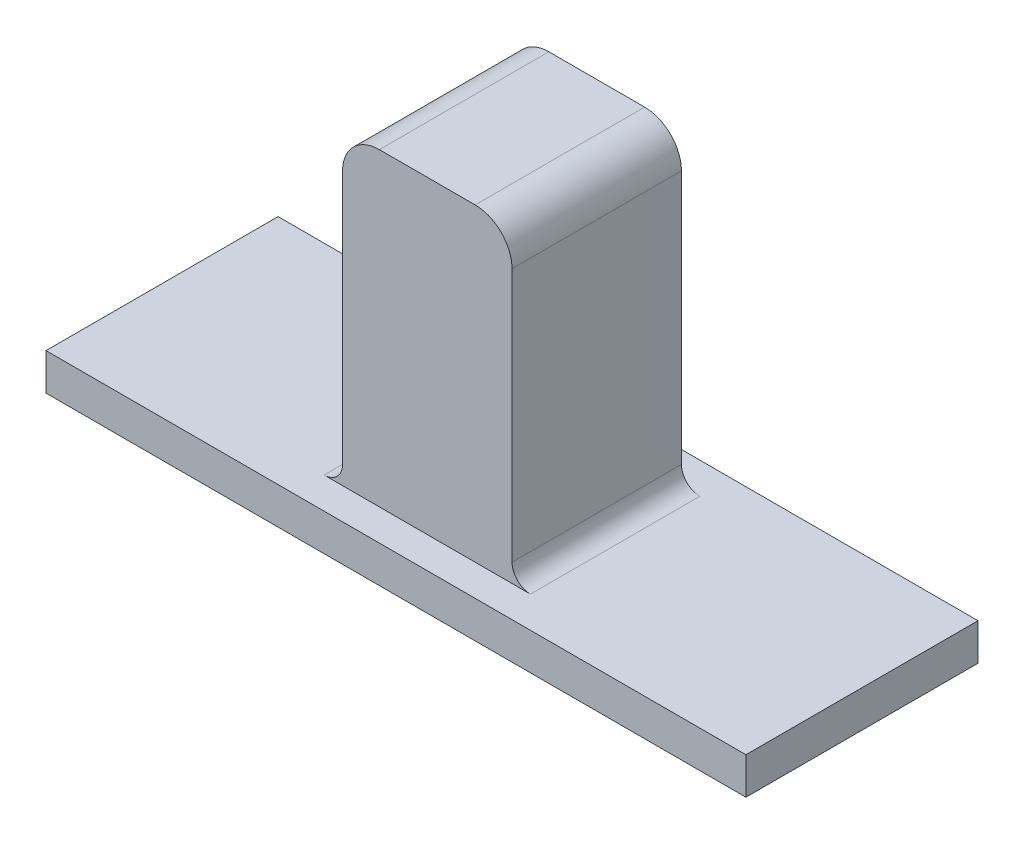
ISO-10303-21;
HEADER;
FILE_DESCRIPTION(('STEP AP214'),'2;1');
FILE_NAME('part.step','',(''),(''),'','','');
FILE_SCHEMA(('AUTOMOTIVE_DESIGN { 1 0 10303 214 1 1 1 1 }'));
ENDSEC;
DATA;
#1=APPLICATION_CONTEXT('core data for automotive mechanical design processes');
#2=APPLICATION_PROTOCOL_DEFINITION('international standard','automotive_design',2000,#1);
#3=PRODUCT_CONTEXT('',#1,'mechanical');
#4=PRODUCT('Part','Part','',(#3));
#5=PRODUCT_RELATED_PRODUCT_CATEGORY('part','',(#4));
#6=PRODUCT_DEFINITION_FORMATION('','',#4);
#7=PRODUCT_DEFINITION_CONTEXT('part definition',#1,'design');
#8=PRODUCT_DEFINITION('design','',#6,#7);
#9=PRODUCT_DEFINITION_SHAPE('','',#8);
#10=(LENGTH_UNIT() NAMED_UNIT(*) SI_UNIT(.MILLI.,.METRE.));
#11=(NAMED_UNIT(*) PLANE_ANGLE_UNIT() SI_UNIT($,.RADIAN.));
#12=(NAMED_UNIT(*) SI_UNIT($,.STERADIAN.) SOLID_ANGLE_UNIT());
#13=UNCERTAINTY_MEASURE_WITH_UNIT(LENGTH_MEASURE(1.E-05),#10,'distance_accuracy_value','');
#14=(GEOMETRIC_REPRESENTATION_CONTEXT(3) GLOBAL_UNCERTAINTY_ASSIGNED_CONTEXT((#13)) GLOBAL_UNIT_ASSIGNED_CONTEXT((#10,
#11,#12)) REPRESENTATION_CONTEXT('',''));
#15=CARTESIAN_POINT('',(0.,0.,0.));
#16=DIRECTION('',(0.,0.,1.));
#17=DIRECTION('',(1.,0.,0.));
#18=AXIS2_PLACEMENT_3D('',#15,#16,#17);
#19=CARTESIAN_POINT('',(0.,0.,0.));
#20=DIRECTION('',(0.,1.,0.));
#21=DIRECTION('',(0.,0.,1.));
#22=AXIS2_PLACEMENT_3D('',#19,#20,#21);
#23=PLANE('',#22);
#24=DIRECTION('',(0.,0.,1.));
#25=VECTOR('',#24,1.);
#26=CARTESIAN_POINT('',(-6.91959795704557,0.,-3.95619761655318));
#27=LINE('',#26,#25);
#28=CARTESIAN_POINT('',(-6.91959795704557,0.,-3.95619761655318));
#29=VERTEX_POINT('',#28);
#30=CARTESIAN_POINT('',(-6.91959795704557,0.,2.34380238344682));
#31=VERTEX_POINT('',#30);
#32=EDGE_CURVE('E289',#29,#31,#27,.T.);
#33=ORIENTED_EDGE('',*,*,#32,.F.);
#34=DIRECTION('',(1.,0.,0.));
#35=VECTOR('',#34,1.);
#36=CARTESIAN_POINT('',(-6.91959795704557,0.,-3.95619761655318));
#37=LINE('',#36,#35);
#38=CARTESIAN_POINT('',(12.0804020429544,0.,-3.95619761655318));
#39=VERTEX_POINT('',#38);
#40=EDGE_CURVE('E294',#29,#39,#37,.T.);
#41=ORIENTED_EDGE('',*,*,#40,.T.);
#42=DIRECTION('',(0.,0.,1.));
#43=VECTOR('',#42,1.);
#44=CARTESIAN_POINT('',(12.0804020429544,0.,-3.95619761655318));
#45=LINE('',#44,#43);
#46=CARTESIAN_POINT('',(12.0804020429544,0.,2.34380238344682));
#47=VERTEX_POINT('',#46);
#48=EDGE_CURVE('E308',#39,#47,#45,.T.);
#49=ORIENTED_EDGE('',*,*,#48,.T.);
#50=DIRECTION('',(1.,0.,0.));
#51=VECTOR('',#50,1.);
#52=CARTESIAN_POINT('',(-6.91959795704557,0.,2.34380238344682));
#53=LINE('',#52,#51);
#54=EDGE_CURVE('E305',#31,#47,#53,.T.);
#55=ORIENTED_EDGE('',*,*,#54,.F.);
#56=EDGE_LOOP('',(#33,#41,#49,#55));
#57=FACE_BOUND('',#56,.T.);
#58=DIRECTION('',(0.,0.,-1.));
#59=VECTOR('',#58,1.);
#60=CARTESIAN_POINT('',(3.33040204295443,0.,0.));
#61=LINE('',#60,#59);
#62=CARTESIAN_POINT('',(3.33040204295443,0.,-0.525612743246029));
#63=VERTEX_POINT('',#62);
#64=CARTESIAN_POINT('',(3.33040204295443,0.,-1.09634673209769));
#65=VERTEX_POINT('',#64);
#66=EDGE_CURVE('E48',#63,#65,#61,.T.);
#67=ORIENTED_EDGE('',*,*,#66,.T.);
#68=DIRECTION('',(1.,0.,0.));
#69=VECTOR('',#68,1.);
#70=CARTESIAN_POINT('',(0.,0.,-1.09634673209769));
#71=LINE('',#70,#69);
#72=CARTESIAN_POINT('',(3.43040204295443,0.,-1.09634673209769));
#73=VERTEX_POINT('',#72);
#74=EDGE_CURVE('E263',#65,#73,#71,.T.);
#75=ORIENTED_EDGE('',*,*,#74,.T.);
#76=DIRECTION('',(0.,0.,1.));
#77=VECTOR('',#76,1.);
#78=CARTESIAN_POINT('',(3.43040204295443,0.,0.));
#79=LINE('',#78,#77);
#80=CARTESIAN_POINT('',(3.43040204295443,0.,-1.65619761655318));
#81=VERTEX_POINT('',#80);
#82=EDGE_CURVE('E764',#81,#73,#79,.T.);
#83=ORIENTED_EDGE('',*,*,#82,.F.);
#84=DIRECTION('',(1.,0.,0.));
#85=VECTOR('',#84,1.);
#86=CARTESIAN_POINT('',(0.,0.,-1.65619761655318));
#87=LINE('',#86,#85);
#88=CARTESIAN_POINT('',(2.86807420810575,0.,-1.65619761655318));
#89=VERTEX_POINT('',#88);
#90=EDGE_CURVE('E767',#89,#81,#87,.T.);
#91=ORIENTED_EDGE('',*,*,#90,.F.);
#92=DIRECTION('',(0.,0.,1.));
#93=VECTOR('',#92,1.);
#94=CARTESIAN_POINT('',(2.86807420810575,0.,0.));
#95=LINE('',#94,#93);
#96=CARTESIAN_POINT('',(2.86807420810575,0.,-1.55619761655318));
#97=VERTEX_POINT('',#96);
#98=EDGE_CURVE('E770',#89,#97,#95,.T.);
#99=ORIENTED_EDGE('',*,*,#98,.T.);
#100=DIRECTION('',(-1.,0.,0.));
#101=VECTOR('',#100,1.);
#102=CARTESIAN_POINT('',(0.,0.,-1.55619761655318));
#103=LINE('',#102,#101);
#104=CARTESIAN_POINT('',(2.28245159295071,0.,-1.55619761655318));
#105=VERTEX_POINT('',#104);
#106=EDGE_CURVE('E777',#97,#105,#103,.T.);
#107=ORIENTED_EDGE('',*,*,#106,.T.);
#108=DIRECTION('',(0.,0.,1.));
#109=VECTOR('',#108,1.);
#110=CARTESIAN_POINT('',(2.28245159295071,0.,0.));
#111=LINE('',#110,#109);
#112=CARTESIAN_POINT('',(2.28245159295071,0.,-1.65619761655318));
#113=VERTEX_POINT('',#112);
#114=EDGE_CURVE('E780',#113,#105,#111,.T.);
#115=ORIENTED_EDGE('',*,*,#114,.F.);
#116=DIRECTION('',(1.,0.,0.));
#117=VECTOR('',#116,1.);
#118=CARTESIAN_POINT('',(0.,0.,-1.65619761655318));
#119=LINE('',#118,#117);
#120=CARTESIAN_POINT('',(1.73040204295443,0.,-1.65619761655318));
#121=VERTEX_POINT('',#120);
#122=EDGE_CURVE('E783',#121,#113,#119,.T.);
#123=ORIENTED_EDGE('',*,*,#122,.F.);
#124=DIRECTION('',(0.,0.,-1.));
#125=VECTOR('',#124,1.);
#126=CARTESIAN_POINT('',(1.73040204295443,0.,0.));
#127=LINE('',#126,#125);
#128=CARTESIAN_POINT('',(1.73040204295443,0.,-1.09634673209769));
#129=VERTEX_POINT('',#128);
#130=EDGE_CURVE('E786',#129,#121,#127,.T.);
#131=ORIENTED_EDGE('',*,*,#130,.F.);
#132=DIRECTION('',(1.,0.,0.));
#133=VECTOR('',#132,1.);
#134=CARTESIAN_POINT('',(0.,0.,-1.09634673209769));
#135=LINE('',#134,#133);
#136=CARTESIAN_POINT('',(1.83040204295443,0.,-1.09634673209769));
#137=VERTEX_POINT('',#136);
#138=EDGE_CURVE('E789',#129,#137,#135,.T.);
#139=ORIENTED_EDGE('',*,*,#138,.T.);
#140=DIRECTION('',(0.,0.,1.));
#141=VECTOR('',#140,1.);
#142=CARTESIAN_POINT('',(1.83040204295443,0.,0.));
#143=LINE('',#142,#141);
#144=CARTESIAN_POINT('',(1.83040204295443,0.,-0.525612743246029));
#145=VERTEX_POINT('',#144);
#146=EDGE_CURVE('E792',#137,#145,#143,.T.);
#147=ORIENTED_EDGE('',*,*,#146,.T.);
#148=DIRECTION('',(1.,0.,0.));
#149=VECTOR('',#148,1.);
#150=CARTESIAN_POINT('',(0.,0.,-0.525612743246029));
#151=LINE('',#150,#149);
#152=CARTESIAN_POINT('',(1.73040204295443,0.,-0.525612743246029));
#153=VERTEX_POINT('',#152);
#154=EDGE_CURVE('E795',#153,#145,#151,.T.);
#155=ORIENTED_EDGE('',*,*,#154,.F.);
#156=DIRECTION('',(0.,0.,-1.));
#157=VECTOR('',#156,1.);
#158=CARTESIAN_POINT('',(1.73040204295443,0.,0.));
#159=LINE('',#158,#157);
#160=CARTESIAN_POINT('',(1.73040204295443,0.,0.0438023834468177));
#161=VERTEX_POINT('',#160);
#162=EDGE_CURVE('E798',#161,#153,#159,.T.);
#163=ORIENTED_EDGE('',*,*,#162,.F.);
#164=DIRECTION('',(-1.,0.,0.));
#165=VECTOR('',#164,1.);
#166=CARTESIAN_POINT('',(0.,0.,0.0438023834468177));
#167=LINE('',#166,#165);
#168=CARTESIAN_POINT('',(2.32148929180198,0.,0.0438023834468177));
#169=VERTEX_POINT('',#168);
#170=EDGE_CURVE('E801',#169,#161,#167,.T.);
#171=ORIENTED_EDGE('',*,*,#170,.F.);
#172=DIRECTION('',(0.,0.,-1.));
#173=VECTOR('',#172,1.);
#174=CARTESIAN_POINT('',(2.32148929180198,0.,0.));
#175=LINE('',#174,#173);
#176=CARTESIAN_POINT('',(2.32148929180198,0.,-0.056197616553179));
#177=VERTEX_POINT('',#176);
#178=EDGE_CURVE('E804',#169,#177,#175,.T.);
#179=ORIENTED_EDGE('',*,*,#178,.T.);
#180=DIRECTION('',(1.,0.,0.));
#181=VECTOR('',#180,1.);
#182=CARTESIAN_POINT('',(0.,0.,-0.056197616553179));
#183=LINE('',#182,#181);
#184=CARTESIAN_POINT('',(2.86807420810575,0.,-0.056197616553179));
#185=VERTEX_POINT('',#184);
#186=EDGE_CURVE('E807',#177,#185,#183,.T.);
#187=ORIENTED_EDGE('',*,*,#186,.T.);
#188=DIRECTION('',(0.,0.,-1.));
#189=VECTOR('',#188,1.);
#190=CARTESIAN_POINT('',(2.86807420810575,0.,0.));
#191=LINE('',#190,#189);
#192=CARTESIAN_POINT('',(2.86807420810575,0.,0.0438023834468177));
#193=VERTEX_POINT('',#192);
#194=EDGE_CURVE('E725',#193,#185,#191,.T.);
#195=ORIENTED_EDGE('',*,*,#194,.F.);
#196=DIRECTION('',(-1.,0.,0.));
#197=VECTOR('',#196,1.);
#198=CARTESIAN_POINT('',(0.,0.,0.0438023834468177));
#199=LINE('',#198,#197);
#200=CARTESIAN_POINT('',(3.43040204295443,0.,0.0438023834468177));
#201=VERTEX_POINT('',#200);
#202=EDGE_CURVE('E723',#201,#193,#199,.T.);
#203=ORIENTED_EDGE('',*,*,#202,.F.);
#204=DIRECTION('',(0.,0.,1.));
#205=VECTOR('',#204,1.);
#206=CARTESIAN_POINT('',(3.43040204295443,0.,0.));
#207=LINE('',#206,#205);
#208=CARTESIAN_POINT('',(3.43040204295443,0.,-0.525612743246029));
#209=VERTEX_POINT('',#208);
#210=EDGE_CURVE('E717',#209,#201,#207,.T.);
#211=ORIENTED_EDGE('',*,*,#210,.F.);
#212=DIRECTION('',(1.,0.,0.));
#213=VECTOR('',#212,1.);
#214=CARTESIAN_POINT('',(0.,0.,-0.525612743246029));
#215=LINE('',#214,#213);
#216=EDGE_CURVE('E259',#63,#209,#215,.T.);
#217=ORIENTED_EDGE('',*,*,#216,.F.);
#218=EDGE_LOOP('',(#67,#75,#83,#91,#99,#107,#115,#123,#131,#139,#147,#155,#163,#171,#179,#187,
#195,#203,#211,#217));
#219=FACE_BOUND('',#218,.T.);
#220=ADVANCED_FACE('F33',(#57,#219),#23,.F.);
#221=CARTESIAN_POINT('',(0.,1.,0.));
#222=DIRECTION('',(0.,1.,0.));
#223=DIRECTION('',(0.,0.,1.));
#224=AXIS2_PLACEMENT_3D('',#221,#222,#223);
#225=PLANE('',#224);
#226=DIRECTION('',(0.,0.,1.));
#227=VECTOR('',#226,1.);
#228=CARTESIAN_POINT('',(-6.91959795704557,1.,-3.95619761655318));
#229=LINE('',#228,#227);
#230=CARTESIAN_POINT('',(-6.91959795704557,1.,-3.95619761655318));
#231=VERTEX_POINT('',#230);
#232=CARTESIAN_POINT('',(-6.91959795704557,1.,2.34380238344682));
#233=VERTEX_POINT('',#232);
#234=EDGE_CURVE('E290',#231,#233,#229,.T.);
#235=ORIENTED_EDGE('',*,*,#234,.T.);
#236=DIRECTION('',(1.,0.,0.));
#237=VECTOR('',#236,1.);
#238=CARTESIAN_POINT('',(-6.91959795704557,1.,2.34380238344682));
#239=LINE('',#238,#237);
#240=CARTESIAN_POINT('',(12.0804020429544,1.,2.34380238344682));
#241=VERTEX_POINT('',#240);
#242=EDGE_CURVE('E293',#233,#241,#239,.T.);
#243=ORIENTED_EDGE('',*,*,#242,.T.);
#244=DIRECTION('',(0.,0.,1.));
#245=VECTOR('',#244,1.);
#246=CARTESIAN_POINT('',(12.0804020429544,1.,-3.95619761655318));
#247=LINE('',#246,#245);
#248=CARTESIAN_POINT('',(12.0804020429544,1.,-3.95619761655318));
#249=VERTEX_POINT('',#248);
#250=EDGE_CURVE('E296',#249,#241,#247,.T.);
#251=ORIENTED_EDGE('',*,*,#250,.F.);
#252=DIRECTION('',(1.,0.,0.));
#253=VECTOR('',#252,1.);
#254=CARTESIAN_POINT('',(-6.91959795704557,1.,-3.95619761655318));
#255=LINE('',#254,#253);
#256=EDGE_CURVE('E299',#231,#249,#255,.T.);
#257=ORIENTED_EDGE('',*,*,#256,.F.);
#258=EDGE_LOOP('',(#235,#243,#251,#257));
#259=FACE_BOUND('',#258,.T.);
#260=DIRECTION('',(0.,0.,-1.));
#261=VECTOR('',#260,1.);
#262=CARTESIAN_POINT('',(-0.219597957045567,1.,0.));
#263=LINE('',#262,#261);
#264=CARTESIAN_POINT('',(-0.219597957045567,1.,1.49380238344682));
#265=VERTEX_POINT('',#264);
#266=CARTESIAN_POINT('',(-0.219597957045568,1.,-3.10619761655318));
#267=VERTEX_POINT('',#266);
#268=EDGE_CURVE('E352',#265,#267,#263,.T.);
#269=ORIENTED_EDGE('',*,*,#268,.T.);
#270=DIRECTION('',(-1.,0.,0.));
#271=VECTOR('',#270,1.);
#272=CARTESIAN_POINT('',(0.,1.,-3.10619761655318));
#273=LINE('',#272,#271);
#274=CARTESIAN_POINT('',(5.38040204295443,1.,-3.10619761655318));
#275=VERTEX_POINT('',#274);
#276=EDGE_CURVE('E285',#275,#267,#273,.T.);
#277=ORIENTED_EDGE('',*,*,#276,.F.);
#278=DIRECTION('',(0.,0.,-1.));
#279=VECTOR('',#278,1.);
#280=CARTESIAN_POINT('',(5.38040204295443,1.,1.49380238344682));
#281=LINE('',#280,#279);
#282=CARTESIAN_POINT('',(5.38040204295443,1.,1.49380238344682));
#283=VERTEX_POINT('',#282);
#284=EDGE_CURVE('E344',#275,#283,#281,.F.);
#285=ORIENTED_EDGE('',*,*,#284,.T.);
#286=DIRECTION('',(-1.,0.,0.));
#287=VECTOR('',#286,1.);
#288=CARTESIAN_POINT('',(0.,1.,1.49380238344682));
#289=LINE('',#288,#287);
#290=EDGE_CURVE('E287',#283,#265,#289,.T.);
#291=ORIENTED_EDGE('',*,*,#290,.T.);
#292=EDGE_LOOP('',(#269,#277,#285,#291));
#293=FACE_BOUND('',#292,.T.);
#294=ADVANCED_FACE('F368',(#259,#293),#225,.T.);
#295=CARTESIAN_POINT('',(-6.91959795704557,1.,-3.95619761655318));
#296=DIRECTION('',(1.,0.,0.));
#297=DIRECTION('',(0.,0.,-1.));
#298=AXIS2_PLACEMENT_3D('',#295,#296,#297);
#299=PLANE('',#298);
#300=ORIENTED_EDGE('',*,*,#32,.T.);
#301=DIRECTION('',(0.,-1.,0.));
#302=VECTOR('',#301,1.);
#303=CARTESIAN_POINT('',(-6.91959795704557,1.,2.34380238344682));
#304=LINE('',#303,#302);
#305=EDGE_CURVE('E318',#233,#31,#304,.T.);
#306=ORIENTED_EDGE('',*,*,#305,.F.);
#307=ORIENTED_EDGE('',*,*,#234,.F.);
#308=DIRECTION('',(0.,-1.,0.));
#309=VECTOR('',#308,1.);
#310=CARTESIAN_POINT('',(-6.91959795704557,1.,-3.95619761655318));
#311=LINE('',#310,#309);
#312=EDGE_CURVE('E302',#231,#29,#311,.T.);
#313=ORIENTED_EDGE('',*,*,#312,.T.);
#314=EDGE_LOOP('',(#300,#306,#307,#313));
#315=FACE_BOUND('',#314,.T.);
#316=ADVANCED_FACE('F404',(#315),#299,.F.);
#317=CARTESIAN_POINT('',(-6.91959795704557,1.,2.34380238344682));
#318=DIRECTION('',(0.,0.,-1.));
#319=DIRECTION('',(-1.,0.,0.));
#320=AXIS2_PLACEMENT_3D('',#317,#318,#319);
#321=PLANE('',#320);
#322=ORIENTED_EDGE('',*,*,#54,.T.);
#323=DIRECTION('',(0.,-1.,0.));
#324=VECTOR('',#323,1.);
#325=CARTESIAN_POINT('',(12.0804020429544,1.,2.34380238344682));
#326=LINE('',#325,#324);
#327=EDGE_CURVE('E316',#241,#47,#326,.T.);
#328=ORIENTED_EDGE('',*,*,#327,.F.);
#329=ORIENTED_EDGE('',*,*,#242,.F.);
#330=ORIENTED_EDGE('',*,*,#305,.T.);
#331=EDGE_LOOP('',(#322,#328,#329,#330));
#332=FACE_BOUND('',#331,.T.);
#333=ADVANCED_FACE('F418',(#332),#321,.F.);
#334=CARTESIAN_POINT('',(12.0804020429544,1.,-3.95619761655318));
#335=DIRECTION('',(1.,0.,0.));
#336=DIRECTION('',(0.,0.,-1.));
#337=AXIS2_PLACEMENT_3D('',#334,#335,#336);
#338=PLANE('',#337);
#339=ORIENTED_EDGE('',*,*,#48,.F.);
#340=DIRECTION('',(0.,-1.,0.));
#341=VECTOR('',#340,1.);
#342=CARTESIAN_POINT('',(12.0804020429544,1.,-3.95619761655318));
#343=LINE('',#342,#341);
#344=EDGE_CURVE('E314',#249,#39,#343,.T.);
#345=ORIENTED_EDGE('',*,*,#344,.F.);
#346=ORIENTED_EDGE('',*,*,#250,.T.);
#347=ORIENTED_EDGE('',*,*,#327,.T.);
#348=EDGE_LOOP('',(#339,#345,#346,#347));
#349=FACE_BOUND('',#348,.T.);
#350=ADVANCED_FACE('F414',(#349),#338,.T.);
#351=CARTESIAN_POINT('',(-6.91959795704557,1.,-3.95619761655318));
#352=DIRECTION('',(0.,0.,-1.));
#353=DIRECTION('',(-1.,0.,0.));
#354=AXIS2_PLACEMENT_3D('',#351,#352,#353);
#355=PLANE('',#354);
#356=ORIENTED_EDGE('',*,*,#40,.F.);
#357=ORIENTED_EDGE('',*,*,#312,.F.);
#358=ORIENTED_EDGE('',*,*,#256,.T.);
#359=ORIENTED_EDGE('',*,*,#344,.T.);
#360=EDGE_LOOP('',(#356,#357,#358,#359));
#361=FACE_BOUND('',#360,.T.);
#362=ADVANCED_FACE('F411',(#361),#355,.T.);
#363=CARTESIAN_POINT('',(0.280402042954432,9.4,-3.10619761655318));
#364=DIRECTION('',(1.,0.,0.));
#365=DIRECTION('',(0.,0.,-1.));
#366=AXIS2_PLACEMENT_3D('',#363,#364,#365);
#367=PLANE('',#366);
#368=DIRECTION('',(0.,-1.,0.));
#369=VECTOR('',#368,1.);
#370=CARTESIAN_POINT('',(0.280402042954432,9.4,-3.10619761655318));
#371=LINE('',#370,#369);
#372=CARTESIAN_POINT('',(0.280402042954432,8.4,-3.10619761655318));
#373=VERTEX_POINT('',#372);
#374=CARTESIAN_POINT('',(0.280402042954432,1.5,-3.10619761655318));
#375=VERTEX_POINT('',#374);
#376=EDGE_CURVE('E274',#373,#375,#371,.T.);
#377=ORIENTED_EDGE('',*,*,#376,.T.);
#378=DIRECTION('',(0.,0.,-1.));
#379=VECTOR('',#378,1.);
#380=CARTESIAN_POINT('',(0.280402042954432,1.5,-3.10619761655318));
#381=LINE('',#380,#379);
#382=CARTESIAN_POINT('',(0.280402042954433,1.5,1.49380238344682));
#383=VERTEX_POINT('',#382);
#384=EDGE_CURVE('E355',#375,#383,#381,.F.);
#385=ORIENTED_EDGE('',*,*,#384,.T.);
#386=DIRECTION('',(0.,-1.,0.));
#387=VECTOR('',#386,1.);
#388=CARTESIAN_POINT('',(0.280402042954433,9.4,1.49380238344682));
#389=LINE('',#388,#387);
#390=CARTESIAN_POINT('',(0.280402042954433,8.4,1.49380238344682));
#391=VERTEX_POINT('',#390);
#392=EDGE_CURVE('E282',#391,#383,#389,.T.);
#393=ORIENTED_EDGE('',*,*,#392,.F.);
#394=DIRECTION('',(0.,0.,1.));
#395=VECTOR('',#394,1.);
#396=CARTESIAN_POINT('',(0.280402042954432,8.4,-3.10619761655318));
#397=LINE('',#396,#395);
#398=EDGE_CURVE('E337',#391,#373,#397,.F.);
#399=ORIENTED_EDGE('',*,*,#398,.T.);
#400=EDGE_LOOP('',(#377,#385,#393,#399));
#401=FACE_BOUND('',#400,.T.);
#402=ADVANCED_FACE('F359',(#401),#367,.F.);
#403=CARTESIAN_POINT('',(0.280402042954433,9.4,1.49380238344682));
#404=DIRECTION('',(0.,0.,-1.));
#405=DIRECTION('',(-1.,0.,0.));
#406=AXIS2_PLACEMENT_3D('',#403,#404,#405);
#407=PLANE('',#406);
#408=DIRECTION('',(1.,0.,0.));
#409=VECTOR('',#408,1.);
#410=CARTESIAN_POINT('',(0.280402042954433,9.4,1.49380238344682));
#411=LINE('',#410,#409);
#412=CARTESIAN_POINT('',(1.28040204295443,9.4,1.49380238344682));
#413=VERTEX_POINT('',#412);
#414=CARTESIAN_POINT('',(3.88040204295443,9.4,1.49380238344682));
#415=VERTEX_POINT('',#414);
#416=EDGE_CURVE('E264',#413,#415,#411,.T.);
#417=ORIENTED_EDGE('',*,*,#416,.F.);
#418=CARTESIAN_POINT('',(1.28040204295443,8.4,1.49380238344682));
#419=DIRECTION('',(0.,0.,-1.));
#420=DIRECTION('',(-1.,0.,0.));
#421=AXIS2_PLACEMENT_3D('',#418,#419,#420);
#422=CIRCLE('',#421,1.);
#423=EDGE_CURVE('E335',#413,#391,#422,.F.);
#424=ORIENTED_EDGE('',*,*,#423,.T.);
#425=ORIENTED_EDGE('',*,*,#392,.T.);
#426=CARTESIAN_POINT('',(-0.219597957045567,1.5,1.49380238344682));
#427=DIRECTION('',(0.,0.,-1.));
#428=DIRECTION('',(-1.,0.,0.));
#429=AXIS2_PLACEMENT_3D('',#426,#427,#428);
#430=CIRCLE('',#429,0.5);
#431=EDGE_CURVE('E11',#383,#265,#430,.T.);
#432=ORIENTED_EDGE('',*,*,#431,.T.);
#433=ORIENTED_EDGE('',*,*,#290,.F.);
#434=CARTESIAN_POINT('',(5.38040204295443,1.5,1.49380238344682));
#435=DIRECTION('',(0.,0.,-1.));
#436=DIRECTION('',(-1.,0.,0.));
#437=AXIS2_PLACEMENT_3D('',#434,#435,#436);
#438=CIRCLE('',#437,0.5);
#439=CARTESIAN_POINT('',(4.88040204295443,1.5,1.49380238344682));
#440=VERTEX_POINT('',#439);
#441=EDGE_CURVE('E350',#283,#440,#438,.T.);
#442=ORIENTED_EDGE('',*,*,#441,.T.);
#443=DIRECTION('',(0.,-1.,0.));
#444=VECTOR('',#443,1.);
#445=CARTESIAN_POINT('',(4.88040204295443,9.4,1.49380238344682));
#446=LINE('',#445,#444);
#447=CARTESIAN_POINT('',(4.88040204295443,8.4,1.49380238344682));
#448=VERTEX_POINT('',#447);
#449=EDGE_CURVE('E279',#448,#440,#446,.T.);
#450=ORIENTED_EDGE('',*,*,#449,.F.);
#451=CARTESIAN_POINT('',(3.88040204295443,8.4,1.49380238344682));
#452=DIRECTION('',(0.,0.,-1.));
#453=DIRECTION('',(-1.,0.,0.));
#454=AXIS2_PLACEMENT_3D('',#451,#452,#453);
#455=CIRCLE('',#454,1.);
#456=EDGE_CURVE('E324',#448,#415,#455,.F.);
#457=ORIENTED_EDGE('',*,*,#456,.T.);
#458=EDGE_LOOP('',(#417,#424,#425,#432,#433,#442,#450,#457));
#459=FACE_BOUND('',#458,.T.);
#460=ADVANCED_FACE('F365',(#459),#407,.F.);
#461=CARTESIAN_POINT('',(4.88040204295443,9.4,-3.10619761655318));
#462=DIRECTION('',(1.,0.,0.));
#463=DIRECTION('',(0.,0.,-1.));
#464=AXIS2_PLACEMENT_3D('',#461,#462,#463);
#465=PLANE('',#464);
#466=ORIENTED_EDGE('',*,*,#449,.T.);
#467=DIRECTION('',(0.,0.,-1.));
#468=VECTOR('',#467,1.);
#469=CARTESIAN_POINT('',(4.88040204295443,1.5,-3.10619761655318));
#470=LINE('',#469,#468);
#471=CARTESIAN_POINT('',(4.88040204295443,1.5,-3.10619761655318));
#472=VERTEX_POINT('',#471);
#473=EDGE_CURVE('E341',#440,#472,#470,.T.);
#474=ORIENTED_EDGE('',*,*,#473,.T.);
#475=DIRECTION('',(0.,-1.,0.));
#476=VECTOR('',#475,1.);
#477=CARTESIAN_POINT('',(4.88040204295443,9.4,-3.10619761655318));
#478=LINE('',#477,#476);
#479=CARTESIAN_POINT('',(4.88040204295443,8.4,-3.10619761655318));
#480=VERTEX_POINT('',#479);
#481=EDGE_CURVE('E276',#480,#472,#478,.T.);
#482=ORIENTED_EDGE('',*,*,#481,.F.);
#483=DIRECTION('',(0.,0.,1.));
#484=VECTOR('',#483,1.);
#485=CARTESIAN_POINT('',(4.88040204295443,8.4,-3.10619761655318));
#486=LINE('',#485,#484);
#487=EDGE_CURVE('E321',#480,#448,#486,.T.);
#488=ORIENTED_EDGE('',*,*,#487,.T.);
#489=EDGE_LOOP('',(#466,#474,#482,#488));
#490=FACE_BOUND('',#489,.T.);
#491=ADVANCED_FACE('F375',(#490),#465,.T.);
#492=CARTESIAN_POINT('',(0.280402042954432,9.4,-3.10619761655318));
#493=DIRECTION('',(0.,0.,-1.));
#494=DIRECTION('',(-1.,0.,0.));
#495=AXIS2_PLACEMENT_3D('',#492,#493,#494);
#496=PLANE('',#495);
#497=ORIENTED_EDGE('',*,*,#376,.F.);
#498=CARTESIAN_POINT('',(1.28040204295443,8.4,-3.10619761655318));
#499=DIRECTION('',(0.,0.,-1.));
#500=DIRECTION('',(-1.,0.,0.));
#501=AXIS2_PLACEMENT_3D('',#498,#499,#500);
#502=CIRCLE('',#501,1.);
#503=CARTESIAN_POINT('',(1.28040204295443,9.4,-3.10619761655318));
#504=VERTEX_POINT('',#503);
#505=EDGE_CURVE('E339',#373,#504,#502,.T.);
#506=ORIENTED_EDGE('',*,*,#505,.T.);
#507=DIRECTION('',(1.,0.,0.));
#508=VECTOR('',#507,1.);
#509=CARTESIAN_POINT('',(0.280402042954432,9.4,-3.10619761655318));
#510=LINE('',#509,#508);
#511=CARTESIAN_POINT('',(3.88040204295443,9.4,-3.10619761655318));
#512=VERTEX_POINT('',#511);
#513=EDGE_CURVE('E267',#504,#512,#510,.T.);
#514=ORIENTED_EDGE('',*,*,#513,.T.);
#515=CARTESIAN_POINT('',(3.88040204295443,8.4,-3.10619761655318));
#516=DIRECTION('',(0.,0.,-1.));
#517=DIRECTION('',(-1.,0.,0.));
#518=AXIS2_PLACEMENT_3D('',#515,#516,#517);
#519=CIRCLE('',#518,1.);
#520=EDGE_CURVE('E330',#512,#480,#519,.T.);
#521=ORIENTED_EDGE('',*,*,#520,.T.);
#522=ORIENTED_EDGE('',*,*,#481,.T.);
#523=CARTESIAN_POINT('',(5.38040204295443,1.5,-3.10619761655318));
#524=DIRECTION('',(0.,0.,-1.));
#525=DIRECTION('',(-1.,0.,0.));
#526=AXIS2_PLACEMENT_3D('',#523,#524,#525);
#527=CIRCLE('',#526,0.5);
#528=EDGE_CURVE('E347',#472,#275,#527,.F.);
#529=ORIENTED_EDGE('',*,*,#528,.T.);
#530=ORIENTED_EDGE('',*,*,#276,.T.);
#531=CARTESIAN_POINT('',(-0.219597957045568,1.5,-3.10619761655318));
#532=DIRECTION('',(0.,0.,-1.));
#533=DIRECTION('',(-1.,0.,0.));
#534=AXIS2_PLACEMENT_3D('',#531,#532,#533);
#535=CIRCLE('',#534,0.5);
#536=EDGE_CURVE('E41',#267,#375,#535,.F.);
#537=ORIENTED_EDGE('',*,*,#536,.T.);
#538=EDGE_LOOP('',(#497,#506,#514,#521,#522,#529,#530,#537));
#539=FACE_BOUND('',#538,.T.);
#540=ADVANCED_FACE('F379',(#539),#496,.T.);
#541=CARTESIAN_POINT('',(0.,9.4,0.));
#542=DIRECTION('',(0.,1.,0.));
#543=DIRECTION('',(0.,0.,1.));
#544=AXIS2_PLACEMENT_3D('',#541,#542,#543);
#545=PLANE('',#544);
#546=ORIENTED_EDGE('',*,*,#513,.F.);
#547=DIRECTION('',(0.,0.,1.));
#548=VECTOR('',#547,1.);
#549=CARTESIAN_POINT('',(1.28040204295443,9.4,1.49380238344682));
#550=LINE('',#549,#548);
#551=EDGE_CURVE('E332',#504,#413,#550,.T.);
#552=ORIENTED_EDGE('',*,*,#551,.T.);
#553=ORIENTED_EDGE('',*,*,#416,.T.);
#554=DIRECTION('',(0.,0.,1.));
#555=VECTOR('',#554,1.);
#556=CARTESIAN_POINT('',(3.88040204295443,9.4,0.));
#557=LINE('',#556,#555);
#558=EDGE_CURVE('E327',#415,#512,#557,.F.);
#559=ORIENTED_EDGE('',*,*,#558,.T.);
#560=EDGE_LOOP('',(#546,#552,#553,#559));
#561=FACE_BOUND('',#560,.T.);
#562=ADVANCED_FACE('F386',(#561),#545,.T.);
#563=CARTESIAN_POINT('',(3.88040204295443,8.4,-3.10619761655318));
#564=DIRECTION('',(0.,0.,1.));
#565=DIRECTION('',(1.,0.,0.));
#566=AXIS2_PLACEMENT_3D('',#563,#564,#565);
#567=CYLINDRICAL_SURFACE('',#566,1.);
#568=ORIENTED_EDGE('',*,*,#520,.F.);
#569=ORIENTED_EDGE('',*,*,#558,.F.);
#570=ORIENTED_EDGE('',*,*,#456,.F.);
#571=ORIENTED_EDGE('',*,*,#487,.F.);
#572=EDGE_LOOP('',(#568,#569,#570,#571));
#573=FACE_BOUND('',#572,.T.);
#574=ADVANCED_FACE('F382',(#573),#567,.T.);
#575=CARTESIAN_POINT('',(1.28040204295443,8.4,0.));
#576=DIRECTION('',(0.,0.,-1.));
#577=DIRECTION('',(-1.,0.,0.));
#578=AXIS2_PLACEMENT_3D('',#575,#576,#577);
#579=CYLINDRICAL_SURFACE('',#578,1.);
#580=ORIENTED_EDGE('',*,*,#505,.F.);
#581=ORIENTED_EDGE('',*,*,#398,.F.);
#582=ORIENTED_EDGE('',*,*,#423,.F.);
#583=ORIENTED_EDGE('',*,*,#551,.F.);
#584=EDGE_LOOP('',(#580,#581,#582,#583));
#585=FACE_BOUND('',#584,.T.);
#586=ADVANCED_FACE('F390',(#585),#579,.T.);
#587=CARTESIAN_POINT('',(5.38040204295443,1.5,-3.10619761655318));
#588=DIRECTION('',(0.,0.,1.));
#589=DIRECTION('',(1.,0.,0.));
#590=AXIS2_PLACEMENT_3D('',#587,#588,#589);
#591=CYLINDRICAL_SURFACE('',#590,0.5);
#592=ORIENTED_EDGE('',*,*,#441,.F.);
#593=ORIENTED_EDGE('',*,*,#284,.F.);
#594=ORIENTED_EDGE('',*,*,#528,.F.);
#595=ORIENTED_EDGE('',*,*,#473,.F.);
#596=EDGE_LOOP('',(#592,#593,#594,#595));
#597=FACE_BOUND('',#596,.T.);
#598=ADVANCED_FACE('F378',(#597),#591,.F.);
#599=CARTESIAN_POINT('',(-0.219597957045567,1.5,0.));
#600=DIRECTION('',(0.,0.,-1.));
#601=DIRECTION('',(-1.,0.,0.));
#602=AXIS2_PLACEMENT_3D('',#599,#600,#601);
#603=CYLINDRICAL_SURFACE('',#602,0.5);
#604=ORIENTED_EDGE('',*,*,#431,.F.);
#605=ORIENTED_EDGE('',*,*,#384,.F.);
#606=ORIENTED_EDGE('',*,*,#536,.F.);
#607=ORIENTED_EDGE('',*,*,#268,.F.);
#608=EDGE_LOOP('',(#604,#605,#606,#607));
#609=FACE_BOUND('',#608,.T.);
#610=ADVANCED_FACE('F35',(#609),#603,.F.);
#611=CARTESIAN_POINT('',(3.33040204295443,3.,0.));
#612=DIRECTION('',(-1.,0.,0.));
#613=DIRECTION('',(0.,0.,1.));
#614=AXIS2_PLACEMENT_3D('',#611,#612,#613);
#615=PLANE('',#614);
#616=ORIENTED_EDGE('',*,*,#66,.F.);
#617=DIRECTION('',(0.,-1.,0.));
#618=VECTOR('',#617,1.);
#619=CARTESIAN_POINT('',(3.33040204295443,3.,-0.525612743246029));
#620=LINE('',#619,#618);
#621=CARTESIAN_POINT('',(3.33040204295443,3.,-0.525612743246029));
#622=VERTEX_POINT('',#621);
#623=EDGE_CURVE('E258',#622,#63,#620,.T.);
#624=ORIENTED_EDGE('',*,*,#623,.F.);
#625=DIRECTION('',(0.,0.,-1.));
#626=VECTOR('',#625,1.);
#627=CARTESIAN_POINT('',(3.33040204295443,3.,0.));
#628=LINE('',#627,#626);
#629=CARTESIAN_POINT('',(3.33040204295443,3.,-1.09634673209769));
#630=VERTEX_POINT('',#629);
#631=EDGE_CURVE('E247',#622,#630,#628,.T.);
#632=ORIENTED_EDGE('',*,*,#631,.T.);
#633=DIRECTION('',(0.,-1.,0.));
#634=VECTOR('',#633,1.);
#635=CARTESIAN_POINT('',(3.33040204295443,3.,-1.09634673209769));
#636=LINE('',#635,#634);
#637=EDGE_CURVE('E257',#630,#65,#636,.T.);
#638=ORIENTED_EDGE('',*,*,#637,.T.);
#639=EDGE_LOOP('',(#616,#624,#632,#638));
#640=FACE_BOUND('',#639,.T.);
#641=ADVANCED_FACE('F256',(#640),#615,.T.);
#642=CARTESIAN_POINT('',(0.,3.,-1.09634673209769));
#643=DIRECTION('',(0.,0.,-1.));
#644=DIRECTION('',(-1.,0.,0.));
#645=AXIS2_PLACEMENT_3D('',#642,#643,#644);
#646=PLANE('',#645);
#647=ORIENTED_EDGE('',*,*,#74,.F.);
#648=ORIENTED_EDGE('',*,*,#637,.F.);
#649=DIRECTION('',(1.,0.,0.));
#650=VECTOR('',#649,1.);
#651=CARTESIAN_POINT('',(0.,3.,-1.09634673209769));
#652=LINE('',#651,#650);
#653=CARTESIAN_POINT('',(3.43040204295443,3.,-1.09634673209769));
#654=VERTEX_POINT('',#653);
#655=EDGE_CURVE('E243',#630,#654,#652,.T.);
#656=ORIENTED_EDGE('',*,*,#655,.T.);
#657=DIRECTION('',(0.,-1.,0.));
#658=VECTOR('',#657,1.);
#659=CARTESIAN_POINT('',(3.43040204295443,3.,-1.09634673209769));
#660=LINE('',#659,#658);
#661=EDGE_CURVE('E265',#654,#73,#660,.T.);
#662=ORIENTED_EDGE('',*,*,#661,.T.);
#663=EDGE_LOOP('',(#647,#648,#656,#662));
#664=FACE_BOUND('',#663,.T.);
#665=ADVANCED_FACE('F261',(#664),#646,.T.);
#666=CARTESIAN_POINT('',(3.43040204295443,3.,0.));
#667=DIRECTION('',(1.,0.,0.));
#668=DIRECTION('',(0.,0.,-1.));
#669=AXIS2_PLACEMENT_3D('',#666,#667,#668);
#670=PLANE('',#669);
#671=ORIENTED_EDGE('',*,*,#82,.T.);
#672=ORIENTED_EDGE('',*,*,#661,.F.);
#673=DIRECTION('',(0.,0.,1.));
#674=VECTOR('',#673,1.);
#675=CARTESIAN_POINT('',(3.43040204295443,3.,0.));
#676=LINE('',#675,#674);
#677=CARTESIAN_POINT('',(3.43040204295443,3.,-1.65619761655318));
#678=VERTEX_POINT('',#677);
#679=EDGE_CURVE('E251',#678,#654,#676,.T.);
#680=ORIENTED_EDGE('',*,*,#679,.F.);
#681=DIRECTION('',(0.,-1.,0.));
#682=VECTOR('',#681,1.);
#683=CARTESIAN_POINT('',(3.43040204295443,3.,-1.65619761655318));
#684=LINE('',#683,#682);
#685=EDGE_CURVE('E269',#678,#81,#684,.T.);
#686=ORIENTED_EDGE('',*,*,#685,.T.);
#687=EDGE_LOOP('',(#671,#672,#680,#686));
#688=FACE_BOUND('',#687,.T.);
#689=ADVANCED_FACE('F519',(#688),#670,.F.);
#690=CARTESIAN_POINT('',(0.,3.,-1.65619761655318));
#691=DIRECTION('',(0.,0.,-1.));
#692=DIRECTION('',(-1.,0.,0.));
#693=AXIS2_PLACEMENT_3D('',#690,#691,#692);
#694=PLANE('',#693);
#695=ORIENTED_EDGE('',*,*,#90,.T.);
#696=ORIENTED_EDGE('',*,*,#685,.F.);
#697=DIRECTION('',(1.,0.,0.));
#698=VECTOR('',#697,1.);
#699=CARTESIAN_POINT('',(0.,3.,-1.65619761655318));
#700=LINE('',#699,#698);
#701=CARTESIAN_POINT('',(2.86807420810575,3.,-1.65619761655318));
#702=VERTEX_POINT('',#701);
#703=EDGE_CURVE('E860',#702,#678,#700,.T.);
#704=ORIENTED_EDGE('',*,*,#703,.F.);
#705=DIRECTION('',(0.,-1.,0.));
#706=VECTOR('',#705,1.);
#707=CARTESIAN_POINT('',(2.86807420810575,3.,-1.65619761655318));
#708=LINE('',#707,#706);
#709=EDGE_CURVE('E760',#702,#89,#708,.T.);
#710=ORIENTED_EDGE('',*,*,#709,.T.);
#711=EDGE_LOOP('',(#695,#696,#704,#710));
#712=FACE_BOUND('',#711,.T.);
#713=ADVANCED_FACE('F527',(#712),#694,.F.);
#714=CARTESIAN_POINT('',(2.86807420810575,3.,0.));
#715=DIRECTION('',(1.,0.,0.));
#716=DIRECTION('',(0.,0.,-1.));
#717=AXIS2_PLACEMENT_3D('',#714,#715,#716);
#718=PLANE('',#717);
#719=ORIENTED_EDGE('',*,*,#98,.F.);
#720=ORIENTED_EDGE('',*,*,#709,.F.);
#721=DIRECTION('',(0.,0.,1.));
#722=VECTOR('',#721,1.);
#723=CARTESIAN_POINT('',(2.86807420810575,3.,0.));
#724=LINE('',#723,#722);
#725=CARTESIAN_POINT('',(2.86807420810575,3.,-1.55619761655318));
#726=VERTEX_POINT('',#725);
#727=EDGE_CURVE('E858',#702,#726,#724,.T.);
#728=ORIENTED_EDGE('',*,*,#727,.T.);
#729=DIRECTION('',(0.,-1.,0.));
#730=VECTOR('',#729,1.);
#731=CARTESIAN_POINT('',(2.86807420810575,3.,-1.55619761655318));
#732=LINE('',#731,#730);
#733=EDGE_CURVE('E758',#726,#97,#732,.T.);
#734=ORIENTED_EDGE('',*,*,#733,.T.);
#735=EDGE_LOOP('',(#719,#720,#728,#734));
#736=FACE_BOUND('',#735,.T.);
#737=ADVANCED_FACE('F536',(#736),#718,.T.);
#738=CARTESIAN_POINT('',(0.,3.,-1.55619761655318));
#739=DIRECTION('',(0.,0.,1.));
#740=DIRECTION('',(1.,0.,0.));
#741=AXIS2_PLACEMENT_3D('',#738,#739,#740);
#742=PLANE('',#741);
#743=ORIENTED_EDGE('',*,*,#106,.F.);
#744=ORIENTED_EDGE('',*,*,#733,.F.);
#745=DIRECTION('',(-1.,0.,0.));
#746=VECTOR('',#745,1.);
#747=CARTESIAN_POINT('',(0.,3.,-1.55619761655318));
#748=LINE('',#747,#746);
#749=CARTESIAN_POINT('',(2.28245159295071,3.,-1.55619761655318));
#750=VERTEX_POINT('',#749);
#751=EDGE_CURVE('E856',#726,#750,#748,.T.);
#752=ORIENTED_EDGE('',*,*,#751,.T.);
#753=DIRECTION('',(0.,-1.,0.));
#754=VECTOR('',#753,1.);
#755=CARTESIAN_POINT('',(2.28245159295071,3.,-1.55619761655318));
#756=LINE('',#755,#754);
#757=EDGE_CURVE('E756',#750,#105,#756,.T.);
#758=ORIENTED_EDGE('',*,*,#757,.T.);
#759=EDGE_LOOP('',(#743,#744,#752,#758));
#760=FACE_BOUND('',#759,.T.);
#761=ADVANCED_FACE('F545',(#760),#742,.T.);
#762=CARTESIAN_POINT('',(2.28245159295071,3.,0.));
#763=DIRECTION('',(1.,0.,0.));
#764=DIRECTION('',(0.,0.,-1.));
#765=AXIS2_PLACEMENT_3D('',#762,#763,#764);
#766=PLANE('',#765);
#767=ORIENTED_EDGE('',*,*,#114,.T.);
#768=ORIENTED_EDGE('',*,*,#757,.F.);
#769=DIRECTION('',(0.,0.,1.));
#770=VECTOR('',#769,1.);
#771=CARTESIAN_POINT('',(2.28245159295071,3.,0.));
#772=LINE('',#771,#770);
#773=CARTESIAN_POINT('',(2.28245159295071,3.,-1.65619761655318));
#774=VERTEX_POINT('',#773);
#775=EDGE_CURVE('E853',#774,#750,#772,.T.);
#776=ORIENTED_EDGE('',*,*,#775,.F.);
#777=DIRECTION('',(0.,-1.,0.));
#778=VECTOR('',#777,1.);
#779=CARTESIAN_POINT('',(2.28245159295071,3.,-1.65619761655318));
#780=LINE('',#779,#778);
#781=EDGE_CURVE('E754',#774,#113,#780,.T.);
#782=ORIENTED_EDGE('',*,*,#781,.T.);
#783=EDGE_LOOP('',(#767,#768,#776,#782));
#784=FACE_BOUND('',#783,.T.);
#785=ADVANCED_FACE('F554',(#784),#766,.F.);
#786=CARTESIAN_POINT('',(0.,3.,-1.65619761655318));
#787=DIRECTION('',(0.,0.,-1.));
#788=DIRECTION('',(-1.,0.,0.));
#789=AXIS2_PLACEMENT_3D('',#786,#787,#788);
#790=PLANE('',#789);
#791=ORIENTED_EDGE('',*,*,#122,.T.);
#792=ORIENTED_EDGE('',*,*,#781,.F.);
#793=DIRECTION('',(1.,0.,0.));
#794=VECTOR('',#793,1.);
#795=CARTESIAN_POINT('',(0.,3.,-1.65619761655318));
#796=LINE('',#795,#794);
#797=CARTESIAN_POINT('',(1.73040204295443,3.,-1.65619761655318));
#798=VERTEX_POINT('',#797);
#799=EDGE_CURVE('E850',#798,#774,#796,.T.);
#800=ORIENTED_EDGE('',*,*,#799,.F.);
#801=DIRECTION('',(0.,-1.,0.));
#802=VECTOR('',#801,1.);
#803=CARTESIAN_POINT('',(1.73040204295443,3.,-1.65619761655318));
#804=LINE('',#803,#802);
#805=EDGE_CURVE('E752',#798,#121,#804,.T.);
#806=ORIENTED_EDGE('',*,*,#805,.T.);
#807=EDGE_LOOP('',(#791,#792,#800,#806));
#808=FACE_BOUND('',#807,.T.);
#809=ADVANCED_FACE('F563',(#808),#790,.F.);
#810=CARTESIAN_POINT('',(1.73040204295443,3.,0.));
#811=DIRECTION('',(-1.,0.,0.));
#812=DIRECTION('',(0.,0.,1.));
#813=AXIS2_PLACEMENT_3D('',#810,#811,#812);
#814=PLANE('',#813);
#815=ORIENTED_EDGE('',*,*,#130,.T.);
#816=ORIENTED_EDGE('',*,*,#805,.F.);
#817=DIRECTION('',(0.,0.,-1.));
#818=VECTOR('',#817,1.);
#819=CARTESIAN_POINT('',(1.73040204295443,3.,0.));
#820=LINE('',#819,#818);
#821=CARTESIAN_POINT('',(1.73040204295443,3.,-1.09634673209769));
#822=VERTEX_POINT('',#821);
#823=EDGE_CURVE('E847',#822,#798,#820,.T.);
#824=ORIENTED_EDGE('',*,*,#823,.F.);
#825=DIRECTION('',(0.,-1.,0.));
#826=VECTOR('',#825,1.);
#827=CARTESIAN_POINT('',(1.73040204295443,3.,-1.09634673209769));
#828=LINE('',#827,#826);
#829=EDGE_CURVE('E750',#822,#129,#828,.T.);
#830=ORIENTED_EDGE('',*,*,#829,.T.);
#831=EDGE_LOOP('',(#815,#816,#824,#830));
#832=FACE_BOUND('',#831,.T.);
#833=ADVANCED_FACE('F572',(#832),#814,.F.);
#834=CARTESIAN_POINT('',(0.,3.,-1.09634673209769));
#835=DIRECTION('',(0.,0.,-1.));
#836=DIRECTION('',(-1.,0.,0.));
#837=AXIS2_PLACEMENT_3D('',#834,#835,#836);
#838=PLANE('',#837);
#839=ORIENTED_EDGE('',*,*,#138,.F.);
#840=ORIENTED_EDGE('',*,*,#829,.F.);
#841=DIRECTION('',(1.,0.,0.));
#842=VECTOR('',#841,1.);
#843=CARTESIAN_POINT('',(0.,3.,-1.09634673209769));
#844=LINE('',#843,#842);
#845=CARTESIAN_POINT('',(1.83040204295443,3.,-1.09634673209769));
#846=VERTEX_POINT('',#845);
#847=EDGE_CURVE('E845',#822,#846,#844,.T.);
#848=ORIENTED_EDGE('',*,*,#847,.T.);
#849=DIRECTION('',(0.,-1.,0.));
#850=VECTOR('',#849,1.);
#851=CARTESIAN_POINT('',(1.83040204295443,3.,-1.09634673209769));
#852=LINE('',#851,#850);
#853=EDGE_CURVE('E748',#846,#137,#852,.T.);
#854=ORIENTED_EDGE('',*,*,#853,.T.);
#855=EDGE_LOOP('',(#839,#840,#848,#854));
#856=FACE_BOUND('',#855,.T.);
#857=ADVANCED_FACE('F581',(#856),#838,.T.);
#858=CARTESIAN_POINT('',(1.83040204295443,3.,0.));
#859=DIRECTION('',(1.,0.,0.));
#860=DIRECTION('',(0.,0.,-1.));
#861=AXIS2_PLACEMENT_3D('',#858,#859,#860);
#862=PLANE('',#861);
#863=ORIENTED_EDGE('',*,*,#146,.F.);
#864=ORIENTED_EDGE('',*,*,#853,.F.);
#865=DIRECTION('',(0.,0.,1.));
#866=VECTOR('',#865,1.);
#867=CARTESIAN_POINT('',(1.83040204295443,3.,0.));
#868=LINE('',#867,#866);
#869=CARTESIAN_POINT('',(1.83040204295443,3.,-0.525612743246029));
#870=VERTEX_POINT('',#869);
#871=EDGE_CURVE('E843',#846,#870,#868,.T.);
#872=ORIENTED_EDGE('',*,*,#871,.T.);
#873=DIRECTION('',(0.,-1.,0.));
#874=VECTOR('',#873,1.);
#875=CARTESIAN_POINT('',(1.83040204295443,3.,-0.525612743246029));
#876=LINE('',#875,#874);
#877=EDGE_CURVE('E746',#870,#145,#876,.T.);
#878=ORIENTED_EDGE('',*,*,#877,.T.);
#879=EDGE_LOOP('',(#863,#864,#872,#878));
#880=FACE_BOUND('',#879,.T.);
#881=ADVANCED_FACE('F590',(#880),#862,.T.);
#882=CARTESIAN_POINT('',(0.,3.,-0.525612743246029));
#883=DIRECTION('',(0.,0.,-1.));
#884=DIRECTION('',(-1.,0.,0.));
#885=AXIS2_PLACEMENT_3D('',#882,#883,#884);
#886=PLANE('',#885);
#887=ORIENTED_EDGE('',*,*,#154,.T.);
#888=ORIENTED_EDGE('',*,*,#877,.F.);
#889=DIRECTION('',(1.,0.,0.));
#890=VECTOR('',#889,1.);
#891=CARTESIAN_POINT('',(0.,3.,-0.525612743246029));
#892=LINE('',#891,#890);
#893=CARTESIAN_POINT('',(1.73040204295443,3.,-0.525612743246029));
#894=VERTEX_POINT('',#893);
#895=EDGE_CURVE('E840',#894,#870,#892,.T.);
#896=ORIENTED_EDGE('',*,*,#895,.F.);
#897=DIRECTION('',(0.,-1.,0.));
#898=VECTOR('',#897,1.);
#899=CARTESIAN_POINT('',(1.73040204295443,3.,-0.525612743246029));
#900=LINE('',#899,#898);
#901=EDGE_CURVE('E744',#894,#153,#900,.T.);
#902=ORIENTED_EDGE('',*,*,#901,.T.);
#903=EDGE_LOOP('',(#887,#888,#896,#902));
#904=FACE_BOUND('',#903,.T.);
#905=ADVANCED_FACE('F599',(#904),#886,.F.);
#906=CARTESIAN_POINT('',(1.73040204295443,3.,0.));
#907=DIRECTION('',(-1.,0.,0.));
#908=DIRECTION('',(0.,0.,1.));
#909=AXIS2_PLACEMENT_3D('',#906,#907,#908);
#910=PLANE('',#909);
#911=ORIENTED_EDGE('',*,*,#162,.T.);
#912=ORIENTED_EDGE('',*,*,#901,.F.);
#913=DIRECTION('',(0.,0.,-1.));
#914=VECTOR('',#913,1.);
#915=CARTESIAN_POINT('',(1.73040204295443,3.,0.));
#916=LINE('',#915,#914);
#917=CARTESIAN_POINT('',(1.73040204295443,3.,0.0438023834468177));
#918=VERTEX_POINT('',#917);
#919=EDGE_CURVE('E837',#918,#894,#916,.T.);
#920=ORIENTED_EDGE('',*,*,#919,.F.);
#921=DIRECTION('',(0.,-1.,0.));
#922=VECTOR('',#921,1.);
#923=CARTESIAN_POINT('',(1.73040204295443,3.,0.0438023834468177));
#924=LINE('',#923,#922);
#925=EDGE_CURVE('E742',#918,#161,#924,.T.);
#926=ORIENTED_EDGE('',*,*,#925,.T.);
#927=EDGE_LOOP('',(#911,#912,#920,#926));
#928=FACE_BOUND('',#927,.T.);
#929=ADVANCED_FACE('F608',(#928),#910,.F.);
#930=CARTESIAN_POINT('',(0.,3.,0.0438023834468177));
#931=DIRECTION('',(0.,0.,1.));
#932=DIRECTION('',(1.,0.,0.));
#933=AXIS2_PLACEMENT_3D('',#930,#931,#932);
#934=PLANE('',#933);
#935=ORIENTED_EDGE('',*,*,#170,.T.);
#936=ORIENTED_EDGE('',*,*,#925,.F.);
#937=DIRECTION('',(-1.,0.,0.));
#938=VECTOR('',#937,1.);
#939=CARTESIAN_POINT('',(0.,3.,0.0438023834468177));
#940=LINE('',#939,#938);
#941=CARTESIAN_POINT('',(2.32148929180198,3.,0.0438023834468177));
#942=VERTEX_POINT('',#941);
#943=EDGE_CURVE('E825',#942,#918,#940,.T.);
#944=ORIENTED_EDGE('',*,*,#943,.F.);
#945=DIRECTION('',(0.,-1.,0.));
#946=VECTOR('',#945,1.);
#947=CARTESIAN_POINT('',(2.32148929180198,3.,0.0438023834468177));
#948=LINE('',#947,#946);
#949=EDGE_CURVE('E740',#942,#169,#948,.T.);
#950=ORIENTED_EDGE('',*,*,#949,.T.);
#951=EDGE_LOOP('',(#935,#936,#944,#950));
#952=FACE_BOUND('',#951,.T.);
#953=ADVANCED_FACE('F617',(#952),#934,.F.);
#954=CARTESIAN_POINT('',(2.32148929180198,3.,0.));
#955=DIRECTION('',(-1.,0.,0.));
#956=DIRECTION('',(0.,0.,1.));
#957=AXIS2_PLACEMENT_3D('',#954,#955,#956);
#958=PLANE('',#957);
#959=ORIENTED_EDGE('',*,*,#178,.F.);
#960=ORIENTED_EDGE('',*,*,#949,.F.);
#961=DIRECTION('',(0.,0.,-1.));
#962=VECTOR('',#961,1.);
#963=CARTESIAN_POINT('',(2.32148929180198,3.,0.));
#964=LINE('',#963,#962);
#965=CARTESIAN_POINT('',(2.32148929180198,3.,-0.056197616553179));
#966=VERTEX_POINT('',#965);
#967=EDGE_CURVE('E821',#942,#966,#964,.T.);
#968=ORIENTED_EDGE('',*,*,#967,.T.);
#969=DIRECTION('',(0.,-1.,0.));
#970=VECTOR('',#969,1.);
#971=CARTESIAN_POINT('',(2.32148929180198,3.,-0.056197616553179));
#972=LINE('',#971,#970);
#973=EDGE_CURVE('E738',#966,#177,#972,.T.);
#974=ORIENTED_EDGE('',*,*,#973,.T.);
#975=EDGE_LOOP('',(#959,#960,#968,#974));
#976=FACE_BOUND('',#975,.T.);
#977=ADVANCED_FACE('F626',(#976),#958,.T.);
#978=CARTESIAN_POINT('',(0.,3.,-0.056197616553179));
#979=DIRECTION('',(0.,0.,-1.));
#980=DIRECTION('',(-1.,0.,0.));
#981=AXIS2_PLACEMENT_3D('',#978,#979,#980);
#982=PLANE('',#981);
#983=ORIENTED_EDGE('',*,*,#186,.F.);
#984=ORIENTED_EDGE('',*,*,#973,.F.);
#985=DIRECTION('',(1.,0.,0.));
#986=VECTOR('',#985,1.);
#987=CARTESIAN_POINT('',(0.,3.,-0.056197616553179));
#988=LINE('',#987,#986);
#989=CARTESIAN_POINT('',(2.86807420810575,3.,-0.056197616553179));
#990=VERTEX_POINT('',#989);
#991=EDGE_CURVE('E818',#966,#990,#988,.T.);
#992=ORIENTED_EDGE('',*,*,#991,.T.);
#993=DIRECTION('',(0.,-1.,0.));
#994=VECTOR('',#993,1.);
#995=CARTESIAN_POINT('',(2.86807420810575,3.,-0.056197616553179));
#996=LINE('',#995,#994);
#997=EDGE_CURVE('E736',#990,#185,#996,.T.);
#998=ORIENTED_EDGE('',*,*,#997,.T.);
#999=EDGE_LOOP('',(#983,#984,#992,#998));
#1000=FACE_BOUND('',#999,.T.);
#1001=ADVANCED_FACE('F635',(#1000),#982,.T.);
#1002=CARTESIAN_POINT('',(2.86807420810575,3.,0.));
#1003=DIRECTION('',(-1.,0.,0.));
#1004=DIRECTION('',(0.,0.,1.));
#1005=AXIS2_PLACEMENT_3D('',#1002,#1003,#1004);
#1006=PLANE('',#1005);
#1007=ORIENTED_EDGE('',*,*,#194,.T.);
#1008=ORIENTED_EDGE('',*,*,#997,.F.);
#1009=DIRECTION('',(0.,0.,-1.));
#1010=VECTOR('',#1009,1.);
#1011=CARTESIAN_POINT('',(2.86807420810575,3.,0.));
#1012=LINE('',#1011,#1010);
#1013=CARTESIAN_POINT('',(2.86807420810575,3.,0.0438023834468177));
#1014=VERTEX_POINT('',#1013);
#1015=EDGE_CURVE('E820',#1014,#990,#1012,.T.);
#1016=ORIENTED_EDGE('',*,*,#1015,.F.);
#1017=DIRECTION('',(0.,-1.,0.));
#1018=VECTOR('',#1017,1.);
#1019=CARTESIAN_POINT('',(2.86807420810575,3.,0.0438023834468177));
#1020=LINE('',#1019,#1018);
#1021=EDGE_CURVE('E734',#1014,#193,#1020,.T.);
#1022=ORIENTED_EDGE('',*,*,#1021,.T.);
#1023=EDGE_LOOP('',(#1007,#1008,#1016,#1022));
#1024=FACE_BOUND('',#1023,.T.);
#1025=ADVANCED_FACE('F644',(#1024),#1006,.F.);
#1026=CARTESIAN_POINT('',(0.,3.,0.0438023834468177));
#1027=DIRECTION('',(0.,0.,1.));
#1028=DIRECTION('',(1.,0.,0.));
#1029=AXIS2_PLACEMENT_3D('',#1026,#1027,#1028);
#1030=PLANE('',#1029);
#1031=ORIENTED_EDGE('',*,*,#202,.T.);
#1032=ORIENTED_EDGE('',*,*,#1021,.F.);
#1033=DIRECTION('',(-1.,0.,0.));
#1034=VECTOR('',#1033,1.);
#1035=CARTESIAN_POINT('',(0.,3.,0.0438023834468177));
#1036=LINE('',#1035,#1034);
#1037=CARTESIAN_POINT('',(3.43040204295443,3.,0.0438023834468177));
#1038=VERTEX_POINT('',#1037);
#1039=EDGE_CURVE('E823',#1038,#1014,#1036,.T.);
#1040=ORIENTED_EDGE('',*,*,#1039,.F.);
#1041=DIRECTION('',(0.,-1.,0.));
#1042=VECTOR('',#1041,1.);
#1043=CARTESIAN_POINT('',(3.43040204295443,3.,0.0438023834468177));
#1044=LINE('',#1043,#1042);
#1045=EDGE_CURVE('E732',#1038,#201,#1044,.T.);
#1046=ORIENTED_EDGE('',*,*,#1045,.T.);
#1047=EDGE_LOOP('',(#1031,#1032,#1040,#1046));
#1048=FACE_BOUND('',#1047,.T.);
#1049=ADVANCED_FACE('F653',(#1048),#1030,.F.);
#1050=CARTESIAN_POINT('',(3.43040204295443,3.,0.));
#1051=DIRECTION('',(1.,0.,0.));
#1052=DIRECTION('',(0.,0.,-1.));
#1053=AXIS2_PLACEMENT_3D('',#1050,#1051,#1052);
#1054=PLANE('',#1053);
#1055=ORIENTED_EDGE('',*,*,#210,.T.);
#1056=ORIENTED_EDGE('',*,*,#1045,.F.);
#1057=DIRECTION('',(0.,0.,1.));
#1058=VECTOR('',#1057,1.);
#1059=CARTESIAN_POINT('',(3.43040204295443,3.,0.));
#1060=LINE('',#1059,#1058);
#1061=CARTESIAN_POINT('',(3.43040204295443,3.,-0.525612743246029));
#1062=VERTEX_POINT('',#1061);
#1063=EDGE_CURVE('E831',#1062,#1038,#1060,.T.);
#1064=ORIENTED_EDGE('',*,*,#1063,.F.);
#1065=DIRECTION('',(0.,-1.,0.));
#1066=VECTOR('',#1065,1.);
#1067=CARTESIAN_POINT('',(3.43040204295443,3.,-0.525612743246029));
#1068=LINE('',#1067,#1066);
#1069=EDGE_CURVE('E715',#1062,#209,#1068,.T.);
#1070=ORIENTED_EDGE('',*,*,#1069,.T.);
#1071=EDGE_LOOP('',(#1055,#1056,#1064,#1070));
#1072=FACE_BOUND('',#1071,.T.);
#1073=ADVANCED_FACE('F662',(#1072),#1054,.F.);
#1074=CARTESIAN_POINT('',(0.,3.,-0.525612743246029));
#1075=DIRECTION('',(0.,0.,-1.));
#1076=DIRECTION('',(-1.,0.,0.));
#1077=AXIS2_PLACEMENT_3D('',#1074,#1075,#1076);
#1078=PLANE('',#1077);
#1079=ORIENTED_EDGE('',*,*,#216,.T.);
#1080=ORIENTED_EDGE('',*,*,#1069,.F.);
#1081=DIRECTION('',(1.,0.,0.));
#1082=VECTOR('',#1081,1.);
#1083=CARTESIAN_POINT('',(0.,3.,-0.525612743246029));
#1084=LINE('',#1083,#1082);
#1085=EDGE_CURVE('E730',#622,#1062,#1084,.T.);
#1086=ORIENTED_EDGE('',*,*,#1085,.F.);
#1087=ORIENTED_EDGE('',*,*,#623,.T.);
#1088=EDGE_LOOP('',(#1079,#1080,#1086,#1087));
#1089=FACE_BOUND('',#1088,.T.);
#1090=ADVANCED_FACE('F671',(#1089),#1078,.F.);
#1091=CARTESIAN_POINT('',(0.,3.,0.));
#1092=DIRECTION('',(0.,1.,0.));
#1093=DIRECTION('',(0.,0.,1.));
#1094=AXIS2_PLACEMENT_3D('',#1091,#1092,#1093);
#1095=PLANE('',#1094);
#1096=ORIENTED_EDGE('',*,*,#631,.F.);
#1097=ORIENTED_EDGE('',*,*,#1085,.T.);
#1098=ORIENTED_EDGE('',*,*,#1063,.T.);
#1099=ORIENTED_EDGE('',*,*,#1039,.T.);
#1100=ORIENTED_EDGE('',*,*,#1015,.T.);
#1101=ORIENTED_EDGE('',*,*,#991,.F.);
#1102=ORIENTED_EDGE('',*,*,#967,.F.);
#1103=ORIENTED_EDGE('',*,*,#943,.T.);
#1104=ORIENTED_EDGE('',*,*,#919,.T.);
#1105=ORIENTED_EDGE('',*,*,#895,.T.);
#1106=ORIENTED_EDGE('',*,*,#871,.F.);
#1107=ORIENTED_EDGE('',*,*,#847,.F.);
#1108=ORIENTED_EDGE('',*,*,#823,.T.);
#1109=ORIENTED_EDGE('',*,*,#799,.T.);
#1110=ORIENTED_EDGE('',*,*,#775,.T.);
#1111=ORIENTED_EDGE('',*,*,#751,.F.);
#1112=ORIENTED_EDGE('',*,*,#727,.F.);
#1113=ORIENTED_EDGE('',*,*,#703,.T.);
#1114=ORIENTED_EDGE('',*,*,#679,.T.);
#1115=ORIENTED_EDGE('',*,*,#655,.F.);
#1116=EDGE_LOOP('',(#1096,#1097,#1098,#1099,#1100,#1101,#1102,#1103,#1104,#1105,#1106,#1107,
#1108,#1109,#1110,#1111,#1112,#1113,#1114,#1115));
#1117=FACE_BOUND('',#1116,.T.);
#1118=ADVANCED_FACE('F245',(#1117),#1095,.F.);
#1119=CLOSED_SHELL('',(#220,#294,#316,#333,#350,#362,#402,#460,#491,#540,#562,#574,#586,#598,
#610,#641,#665,#689,#713,#737,#761,#785,#809,#833,#857,#881,#905,#929,#953,#977,#1001,#1025,
#1049,#1073,#1090,#1118));
#1120=MANIFOLD_SOLID_BREP('B2',#1119);
#1121=ADVANCED_BREP_SHAPE_REPRESENTATION('',(#18,#1120),#14);
#1122=SHAPE_DEFINITION_REPRESENTATION(#9,#1121);
ENDSEC;
END-ISO-10303-21;
